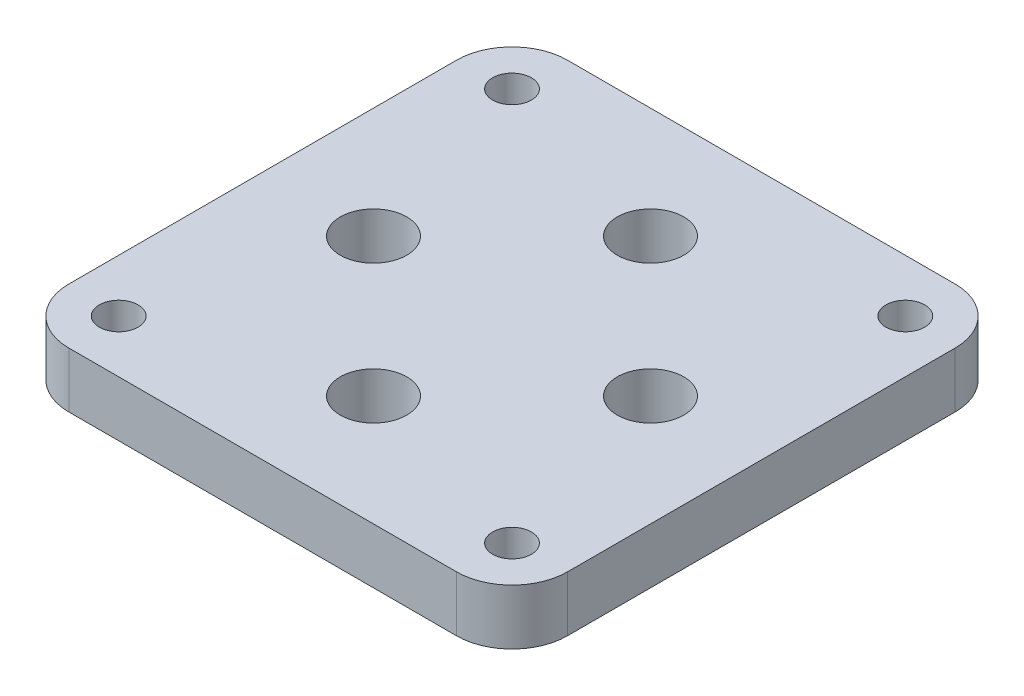
ISO-10303-21;
HEADER;
FILE_DESCRIPTION(('STEP AP214'),'2;1');
FILE_NAME('part.step','',(''),(''),'','','');
FILE_SCHEMA(('AUTOMOTIVE_DESIGN { 1 0 10303 214 1 1 1 1 }'));
ENDSEC;
DATA;
#1=APPLICATION_CONTEXT('core data for automotive mechanical design processes');
#2=APPLICATION_PROTOCOL_DEFINITION('international standard','automotive_design',2000,#1);
#3=PRODUCT_CONTEXT('',#1,'mechanical');
#4=PRODUCT('Part','Part','',(#3));
#5=PRODUCT_RELATED_PRODUCT_CATEGORY('part','',(#4));
#6=PRODUCT_DEFINITION_FORMATION('','',#4);
#7=PRODUCT_DEFINITION_CONTEXT('part definition',#1,'design');
#8=PRODUCT_DEFINITION('design','',#6,#7);
#9=PRODUCT_DEFINITION_SHAPE('','',#8);
#10=(LENGTH_UNIT() NAMED_UNIT(*) SI_UNIT(.MILLI.,.METRE.));
#11=(NAMED_UNIT(*) PLANE_ANGLE_UNIT() SI_UNIT($,.RADIAN.));
#12=(NAMED_UNIT(*) SI_UNIT($,.STERADIAN.) SOLID_ANGLE_UNIT());
#13=UNCERTAINTY_MEASURE_WITH_UNIT(LENGTH_MEASURE(1.E-05),#10,'distance_accuracy_value','');
#14=(GEOMETRIC_REPRESENTATION_CONTEXT(3) GLOBAL_UNCERTAINTY_ASSIGNED_CONTEXT((#13)) GLOBAL_UNIT_ASSIGNED_CONTEXT((#10,
#11,#12)) REPRESENTATION_CONTEXT('',''));
#15=CARTESIAN_POINT('',(0.,0.,0.));
#16=DIRECTION('',(0.,0.,1.));
#17=DIRECTION('',(1.,0.,0.));
#18=AXIS2_PLACEMENT_3D('',#15,#16,#17);
#19=CARTESIAN_POINT('',(45.,10.,-45.));
#20=DIRECTION('',(-1.,0.,0.));
#21=DIRECTION('',(0.,0.,1.));
#22=AXIS2_PLACEMENT_3D('',#19,#20,#21);
#23=PLANE('',#22);
#24=DIRECTION('',(0.,0.,-1.));
#25=VECTOR('',#24,1.);
#26=CARTESIAN_POINT('',(45.,0.,-45.));
#27=LINE('',#26,#25);
#28=CARTESIAN_POINT('',(45.,0.,35.));
#29=VERTEX_POINT('',#28);
#30=CARTESIAN_POINT('',(45.,0.,-35.));
#31=VERTEX_POINT('',#30);
#32=EDGE_CURVE('E125',#29,#31,#27,.T.);
#33=ORIENTED_EDGE('',*,*,#32,.T.);
#34=DIRECTION('',(0.,-1.,0.));
#35=VECTOR('',#34,1.);
#36=CARTESIAN_POINT('',(45.,10.,-35.));
#37=LINE('',#36,#35);
#38=CARTESIAN_POINT('',(45.,10.,-35.));
#39=VERTEX_POINT('',#38);
#40=EDGE_CURVE('E103',#31,#39,#37,.F.);
#41=ORIENTED_EDGE('',*,*,#40,.T.);
#42=DIRECTION('',(0.,0.,-1.));
#43=VECTOR('',#42,1.);
#44=CARTESIAN_POINT('',(45.,10.,-45.));
#45=LINE('',#44,#43);
#46=CARTESIAN_POINT('',(45.,10.,35.));
#47=VERTEX_POINT('',#46);
#48=EDGE_CURVE('E135',#47,#39,#45,.T.);
#49=ORIENTED_EDGE('',*,*,#48,.F.);
#50=DIRECTION('',(0.,-1.,0.));
#51=VECTOR('',#50,1.);
#52=CARTESIAN_POINT('',(45.,10.,35.));
#53=LINE('',#52,#51);
#54=EDGE_CURVE('E108',#47,#29,#53,.T.);
#55=ORIENTED_EDGE('',*,*,#54,.T.);
#56=EDGE_LOOP('',(#33,#41,#49,#55));
#57=FACE_BOUND('',#56,.T.);
#58=ADVANCED_FACE('F33',(#57),#23,.F.);
#59=CARTESIAN_POINT('',(-45.,10.,-45.));
#60=DIRECTION('',(0.,0.,1.));
#61=DIRECTION('',(1.,0.,0.));
#62=AXIS2_PLACEMENT_3D('',#59,#60,#61);
#63=PLANE('',#62);
#64=DIRECTION('',(-1.,0.,0.));
#65=VECTOR('',#64,1.);
#66=CARTESIAN_POINT('',(-45.,10.,-45.));
#67=LINE('',#66,#65);
#68=CARTESIAN_POINT('',(35.,10.,-45.));
#69=VERTEX_POINT('',#68);
#70=CARTESIAN_POINT('',(-35.,10.,-45.));
#71=VERTEX_POINT('',#70);
#72=EDGE_CURVE('E118',#69,#71,#67,.T.);
#73=ORIENTED_EDGE('',*,*,#72,.F.);
#74=DIRECTION('',(0.,-1.,0.));
#75=VECTOR('',#74,1.);
#76=CARTESIAN_POINT('',(35.,10.,-45.));
#77=LINE('',#76,#75);
#78=CARTESIAN_POINT('',(35.,0.,-45.));
#79=VERTEX_POINT('',#78);
#80=EDGE_CURVE('E102',#69,#79,#77,.T.);
#81=ORIENTED_EDGE('',*,*,#80,.T.);
#82=DIRECTION('',(-1.,0.,0.));
#83=VECTOR('',#82,1.);
#84=CARTESIAN_POINT('',(-45.,0.,-45.));
#85=LINE('',#84,#83);
#86=CARTESIAN_POINT('',(-35.,0.,-45.));
#87=VERTEX_POINT('',#86);
#88=EDGE_CURVE('E115',#79,#87,#85,.T.);
#89=ORIENTED_EDGE('',*,*,#88,.T.);
#90=DIRECTION('',(0.,-1.,0.));
#91=VECTOR('',#90,1.);
#92=CARTESIAN_POINT('',(-35.,10.,-45.));
#93=LINE('',#92,#91);
#94=EDGE_CURVE('E120',#87,#71,#93,.F.);
#95=ORIENTED_EDGE('',*,*,#94,.T.);
#96=EDGE_LOOP('',(#73,#81,#89,#95));
#97=FACE_BOUND('',#96,.T.);
#98=ADVANCED_FACE('F114',(#97),#63,.F.);
#99=CARTESIAN_POINT('',(-45.,10.,-45.));
#100=DIRECTION('',(1.,0.,0.));
#101=DIRECTION('',(0.,0.,-1.));
#102=AXIS2_PLACEMENT_3D('',#99,#100,#101);
#103=PLANE('',#102);
#104=DIRECTION('',(0.,0.,1.));
#105=VECTOR('',#104,1.);
#106=CARTESIAN_POINT('',(-45.,10.,-45.));
#107=LINE('',#106,#105);
#108=CARTESIAN_POINT('',(-45.,10.,-35.));
#109=VERTEX_POINT('',#108);
#110=CARTESIAN_POINT('',(-45.,10.,35.));
#111=VERTEX_POINT('',#110);
#112=EDGE_CURVE('E183',#109,#111,#107,.T.);
#113=ORIENTED_EDGE('',*,*,#112,.F.);
#114=DIRECTION('',(0.,-1.,0.));
#115=VECTOR('',#114,1.);
#116=CARTESIAN_POINT('',(-45.,10.,-35.));
#117=LINE('',#116,#115);
#118=CARTESIAN_POINT('',(-45.,0.,-35.));
#119=VERTEX_POINT('',#118);
#120=EDGE_CURVE('E168',#109,#119,#117,.T.);
#121=ORIENTED_EDGE('',*,*,#120,.T.);
#122=DIRECTION('',(0.,0.,1.));
#123=VECTOR('',#122,1.);
#124=CARTESIAN_POINT('',(-45.,0.,-45.));
#125=LINE('',#124,#123);
#126=CARTESIAN_POINT('',(-45.,0.,35.));
#127=VERTEX_POINT('',#126);
#128=EDGE_CURVE('E124',#119,#127,#125,.T.);
#129=ORIENTED_EDGE('',*,*,#128,.T.);
#130=DIRECTION('',(0.,-1.,0.));
#131=VECTOR('',#130,1.);
#132=CARTESIAN_POINT('',(-45.,10.,35.));
#133=LINE('',#132,#131);
#134=EDGE_CURVE('E166',#127,#111,#133,.F.);
#135=ORIENTED_EDGE('',*,*,#134,.T.);
#136=EDGE_LOOP('',(#113,#121,#129,#135));
#137=FACE_BOUND('',#136,.T.);
#138=ADVANCED_FACE('F199',(#137),#103,.F.);
#139=CARTESIAN_POINT('',(-45.,10.,45.));
#140=DIRECTION('',(0.,0.,-1.));
#141=DIRECTION('',(-1.,0.,0.));
#142=AXIS2_PLACEMENT_3D('',#139,#140,#141);
#143=PLANE('',#142);
#144=DIRECTION('',(1.,0.,0.));
#145=VECTOR('',#144,1.);
#146=CARTESIAN_POINT('',(-45.,0.,45.));
#147=LINE('',#146,#145);
#148=CARTESIAN_POINT('',(-35.,0.,45.));
#149=VERTEX_POINT('',#148);
#150=CARTESIAN_POINT('',(35.,0.,45.));
#151=VERTEX_POINT('',#150);
#152=EDGE_CURVE('E128',#149,#151,#147,.T.);
#153=ORIENTED_EDGE('',*,*,#152,.T.);
#154=DIRECTION('',(0.,-1.,0.));
#155=VECTOR('',#154,1.);
#156=CARTESIAN_POINT('',(35.,10.,45.));
#157=LINE('',#156,#155);
#158=CARTESIAN_POINT('',(35.,10.,45.));
#159=VERTEX_POINT('',#158);
#160=EDGE_CURVE('E11',#151,#159,#157,.F.);
#161=ORIENTED_EDGE('',*,*,#160,.T.);
#162=DIRECTION('',(1.,0.,0.));
#163=VECTOR('',#162,1.);
#164=CARTESIAN_POINT('',(-45.,10.,45.));
#165=LINE('',#164,#163);
#166=CARTESIAN_POINT('',(-35.,10.,45.));
#167=VERTEX_POINT('',#166);
#168=EDGE_CURVE('E150',#167,#159,#165,.T.);
#169=ORIENTED_EDGE('',*,*,#168,.F.);
#170=DIRECTION('',(0.,-1.,0.));
#171=VECTOR('',#170,1.);
#172=CARTESIAN_POINT('',(-35.,10.,45.));
#173=LINE('',#172,#171);
#174=EDGE_CURVE('E41',#167,#149,#173,.T.);
#175=ORIENTED_EDGE('',*,*,#174,.T.);
#176=EDGE_LOOP('',(#153,#161,#169,#175));
#177=FACE_BOUND('',#176,.T.);
#178=ADVANCED_FACE('F173',(#177),#143,.F.);
#179=CARTESIAN_POINT('',(0.,10.,0.));
#180=DIRECTION('',(0.,1.,0.));
#181=DIRECTION('',(0.,0.,1.));
#182=AXIS2_PLACEMENT_3D('',#179,#180,#181);
#183=PLANE('',#182);
#184=CARTESIAN_POINT('',(0.,10.,25.));
#185=DIRECTION('',(0.,1.,0.));
#186=DIRECTION('',(0.,0.,1.));
#187=AXIS2_PLACEMENT_3D('',#184,#185,#186);
#188=CIRCLE('',#187,6.);
#189=CARTESIAN_POINT('',(0.,10.,31.));
#190=VERTEX_POINT('',#189);
#191=EDGE_CURVE('E140',#190,#190,#188,.T.);
#192=ORIENTED_EDGE('',*,*,#191,.F.);
#193=EDGE_LOOP('',(#192));
#194=FACE_BOUND('',#193,.T.);
#195=CARTESIAN_POINT('',(25.,10.,0.));
#196=DIRECTION('',(0.,1.,0.));
#197=DIRECTION('',(0.,0.,1.));
#198=AXIS2_PLACEMENT_3D('',#195,#196,#197);
#199=CIRCLE('',#198,6.);
#200=CARTESIAN_POINT('',(25.,10.,6.));
#201=VERTEX_POINT('',#200);
#202=EDGE_CURVE('E380',#201,#201,#199,.T.);
#203=ORIENTED_EDGE('',*,*,#202,.F.);
#204=EDGE_LOOP('',(#203));
#205=FACE_BOUND('',#204,.T.);
#206=CARTESIAN_POINT('',(-25.,10.,0.));
#207=DIRECTION('',(0.,1.,0.));
#208=DIRECTION('',(0.,0.,1.));
#209=AXIS2_PLACEMENT_3D('',#206,#207,#208);
#210=CIRCLE('',#209,6.);
#211=CARTESIAN_POINT('',(-25.,10.,6.));
#212=VERTEX_POINT('',#211);
#213=EDGE_CURVE('E377',#212,#212,#210,.T.);
#214=ORIENTED_EDGE('',*,*,#213,.F.);
#215=EDGE_LOOP('',(#214));
#216=FACE_BOUND('',#215,.T.);
#217=CARTESIAN_POINT('',(0.,10.,-25.));
#218=DIRECTION('',(0.,1.,0.));
#219=DIRECTION('',(0.,0.,1.));
#220=AXIS2_PLACEMENT_3D('',#217,#218,#219);
#221=CIRCLE('',#220,6.);
#222=CARTESIAN_POINT('',(0.,10.,-19.));
#223=VERTEX_POINT('',#222);
#224=EDGE_CURVE('E374',#223,#223,#221,.T.);
#225=ORIENTED_EDGE('',*,*,#224,.F.);
#226=EDGE_LOOP('',(#225));
#227=FACE_BOUND('',#226,.T.);
#228=CARTESIAN_POINT('',(-35.5,10.,-35.5));
#229=DIRECTION('',(0.,1.,0.));
#230=DIRECTION('',(0.,0.,1.));
#231=AXIS2_PLACEMENT_3D('',#228,#229,#230);
#232=CIRCLE('',#231,3.49999999999999);
#233=CARTESIAN_POINT('',(-35.5,10.,-32.));
#234=VERTEX_POINT('',#233);
#235=EDGE_CURVE('E149',#234,#234,#232,.T.);
#236=ORIENTED_EDGE('',*,*,#235,.F.);
#237=EDGE_LOOP('',(#236));
#238=FACE_BOUND('',#237,.T.);
#239=CARTESIAN_POINT('',(35.5,10.,-35.5));
#240=DIRECTION('',(0.,1.,0.));
#241=DIRECTION('',(0.,0.,1.));
#242=AXIS2_PLACEMENT_3D('',#239,#240,#241);
#243=CIRCLE('',#242,3.49999999999999);
#244=CARTESIAN_POINT('',(35.5,10.,-32.));
#245=VERTEX_POINT('',#244);
#246=EDGE_CURVE('E366',#245,#245,#243,.T.);
#247=ORIENTED_EDGE('',*,*,#246,.F.);
#248=EDGE_LOOP('',(#247));
#249=FACE_BOUND('',#248,.T.);
#250=CARTESIAN_POINT('',(-35.5,10.,35.5));
#251=DIRECTION('',(0.,1.,0.));
#252=DIRECTION('',(0.,0.,1.));
#253=AXIS2_PLACEMENT_3D('',#250,#251,#252);
#254=CIRCLE('',#253,3.49999999999999);
#255=CARTESIAN_POINT('',(-35.5,10.,39.));
#256=VERTEX_POINT('',#255);
#257=EDGE_CURVE('E358',#256,#256,#254,.T.);
#258=ORIENTED_EDGE('',*,*,#257,.F.);
#259=EDGE_LOOP('',(#258));
#260=FACE_BOUND('',#259,.T.);
#261=CARTESIAN_POINT('',(35.5,10.,35.5));
#262=DIRECTION('',(0.,1.,0.));
#263=DIRECTION('',(0.,0.,1.));
#264=AXIS2_PLACEMENT_3D('',#261,#262,#263);
#265=CIRCLE('',#264,3.49999999999999);
#266=CARTESIAN_POINT('',(35.5,10.,39.));
#267=VERTEX_POINT('',#266);
#268=EDGE_CURVE('E354',#267,#267,#265,.T.);
#269=ORIENTED_EDGE('',*,*,#268,.F.);
#270=EDGE_LOOP('',(#269));
#271=FACE_BOUND('',#270,.T.);
#272=ORIENTED_EDGE('',*,*,#48,.T.);
#273=CARTESIAN_POINT('',(35.,10.,-35.));
#274=DIRECTION('',(0.,1.,0.));
#275=DIRECTION('',(0.,0.,1.));
#276=AXIS2_PLACEMENT_3D('',#273,#274,#275);
#277=CIRCLE('',#276,10.);
#278=EDGE_CURVE('E164',#39,#69,#277,.T.);
#279=ORIENTED_EDGE('',*,*,#278,.T.);
#280=ORIENTED_EDGE('',*,*,#72,.T.);
#281=CARTESIAN_POINT('',(-35.,10.,-35.));
#282=DIRECTION('',(0.,1.,0.));
#283=DIRECTION('',(0.,0.,1.));
#284=AXIS2_PLACEMENT_3D('',#281,#282,#283);
#285=CIRCLE('',#284,10.);
#286=EDGE_CURVE('E162',#71,#109,#285,.T.);
#287=ORIENTED_EDGE('',*,*,#286,.T.);
#288=ORIENTED_EDGE('',*,*,#112,.T.);
#289=CARTESIAN_POINT('',(-35.,10.,35.));
#290=DIRECTION('',(0.,1.,0.));
#291=DIRECTION('',(0.,0.,1.));
#292=AXIS2_PLACEMENT_3D('',#289,#290,#291);
#293=CIRCLE('',#292,10.);
#294=EDGE_CURVE('E53',#111,#167,#293,.T.);
#295=ORIENTED_EDGE('',*,*,#294,.T.);
#296=ORIENTED_EDGE('',*,*,#168,.T.);
#297=CARTESIAN_POINT('',(35.,10.,35.));
#298=DIRECTION('',(0.,1.,0.));
#299=DIRECTION('',(0.,0.,1.));
#300=AXIS2_PLACEMENT_3D('',#297,#298,#299);
#301=CIRCLE('',#300,10.);
#302=EDGE_CURVE('E160',#159,#47,#301,.T.);
#303=ORIENTED_EDGE('',*,*,#302,.T.);
#304=EDGE_LOOP('',(#272,#279,#280,#287,#288,#295,#296,#303));
#305=FACE_BOUND('',#304,.T.);
#306=ADVANCED_FACE('F188',(#194,#205,#216,#227,#238,#249,#260,#271,#305),#183,.T.);
#307=CARTESIAN_POINT('',(0.,0.,0.));
#308=DIRECTION('',(0.,1.,0.));
#309=DIRECTION('',(0.,0.,1.));
#310=AXIS2_PLACEMENT_3D('',#307,#308,#309);
#311=PLANE('',#310);
#312=CARTESIAN_POINT('',(0.,0.,25.));
#313=DIRECTION('',(0.,1.,0.));
#314=DIRECTION('',(0.,0.,1.));
#315=AXIS2_PLACEMENT_3D('',#312,#313,#314);
#316=CIRCLE('',#315,6.);
#317=CARTESIAN_POINT('',(0.,0.,31.));
#318=VERTEX_POINT('',#317);
#319=EDGE_CURVE('E146',#318,#318,#316,.T.);
#320=ORIENTED_EDGE('',*,*,#319,.T.);
#321=EDGE_LOOP('',(#320));
#322=FACE_BOUND('',#321,.T.);
#323=CARTESIAN_POINT('',(25.,0.,0.));
#324=DIRECTION('',(0.,1.,0.));
#325=DIRECTION('',(0.,0.,1.));
#326=AXIS2_PLACEMENT_3D('',#323,#324,#325);
#327=CIRCLE('',#326,6.);
#328=CARTESIAN_POINT('',(25.,0.,6.));
#329=VERTEX_POINT('',#328);
#330=EDGE_CURVE('E143',#329,#329,#327,.T.);
#331=ORIENTED_EDGE('',*,*,#330,.T.);
#332=EDGE_LOOP('',(#331));
#333=FACE_BOUND('',#332,.T.);
#334=CARTESIAN_POINT('',(-25.,0.,0.));
#335=DIRECTION('',(0.,1.,0.));
#336=DIRECTION('',(0.,0.,1.));
#337=AXIS2_PLACEMENT_3D('',#334,#335,#336);
#338=CIRCLE('',#337,6.);
#339=CARTESIAN_POINT('',(-25.,0.,6.));
#340=VERTEX_POINT('',#339);
#341=EDGE_CURVE('E139',#340,#340,#338,.T.);
#342=ORIENTED_EDGE('',*,*,#341,.T.);
#343=EDGE_LOOP('',(#342));
#344=FACE_BOUND('',#343,.T.);
#345=CARTESIAN_POINT('',(0.,0.,-25.));
#346=DIRECTION('',(0.,1.,0.));
#347=DIRECTION('',(0.,0.,1.));
#348=AXIS2_PLACEMENT_3D('',#345,#346,#347);
#349=CIRCLE('',#348,6.);
#350=CARTESIAN_POINT('',(0.,0.,-19.));
#351=VERTEX_POINT('',#350);
#352=EDGE_CURVE('E136',#351,#351,#349,.T.);
#353=ORIENTED_EDGE('',*,*,#352,.T.);
#354=EDGE_LOOP('',(#353));
#355=FACE_BOUND('',#354,.T.);
#356=CARTESIAN_POINT('',(-35.5,0.,-35.5));
#357=DIRECTION('',(0.,1.,0.));
#358=DIRECTION('',(0.,0.,1.));
#359=AXIS2_PLACEMENT_3D('',#356,#357,#358);
#360=CIRCLE('',#359,3.49999999999999);
#361=CARTESIAN_POINT('',(-35.5,0.,-32.));
#362=VERTEX_POINT('',#361);
#363=EDGE_CURVE('E369',#362,#362,#360,.T.);
#364=ORIENTED_EDGE('',*,*,#363,.T.);
#365=EDGE_LOOP('',(#364));
#366=FACE_BOUND('',#365,.T.);
#367=CARTESIAN_POINT('',(35.5,0.,-35.5));
#368=DIRECTION('',(0.,1.,0.));
#369=DIRECTION('',(0.,0.,1.));
#370=AXIS2_PLACEMENT_3D('',#367,#368,#369);
#371=CIRCLE('',#370,3.49999999999999);
#372=CARTESIAN_POINT('',(35.5,0.,-32.));
#373=VERTEX_POINT('',#372);
#374=EDGE_CURVE('E363',#373,#373,#371,.T.);
#375=ORIENTED_EDGE('',*,*,#374,.T.);
#376=EDGE_LOOP('',(#375));
#377=FACE_BOUND('',#376,.T.);
#378=CARTESIAN_POINT('',(-35.5,0.,35.5));
#379=DIRECTION('',(0.,1.,0.));
#380=DIRECTION('',(0.,0.,1.));
#381=AXIS2_PLACEMENT_3D('',#378,#379,#380);
#382=CIRCLE('',#381,3.49999999999999);
#383=CARTESIAN_POINT('',(-35.5,0.,39.));
#384=VERTEX_POINT('',#383);
#385=EDGE_CURVE('E356',#384,#384,#382,.T.);
#386=ORIENTED_EDGE('',*,*,#385,.T.);
#387=EDGE_LOOP('',(#386));
#388=FACE_BOUND('',#387,.T.);
#389=CARTESIAN_POINT('',(35.5,0.,35.5));
#390=DIRECTION('',(0.,1.,0.));
#391=DIRECTION('',(0.,0.,1.));
#392=AXIS2_PLACEMENT_3D('',#389,#390,#391);
#393=CIRCLE('',#392,3.49999999999999);
#394=CARTESIAN_POINT('',(35.5,0.,39.));
#395=VERTEX_POINT('',#394);
#396=EDGE_CURVE('E130',#395,#395,#393,.T.);
#397=ORIENTED_EDGE('',*,*,#396,.T.);
#398=EDGE_LOOP('',(#397));
#399=FACE_BOUND('',#398,.T.);
#400=ORIENTED_EDGE('',*,*,#88,.F.);
#401=CARTESIAN_POINT('',(35.,0.,-35.));
#402=DIRECTION('',(0.,1.,0.));
#403=DIRECTION('',(0.,0.,1.));
#404=AXIS2_PLACEMENT_3D('',#401,#402,#403);
#405=CIRCLE('',#404,10.);
#406=EDGE_CURVE('E98',#79,#31,#405,.F.);
#407=ORIENTED_EDGE('',*,*,#406,.T.);
#408=ORIENTED_EDGE('',*,*,#32,.F.);
#409=CARTESIAN_POINT('',(35.,0.,35.));
#410=DIRECTION('',(0.,1.,0.));
#411=DIRECTION('',(0.,0.,1.));
#412=AXIS2_PLACEMENT_3D('',#409,#410,#411);
#413=CIRCLE('',#412,10.);
#414=EDGE_CURVE('E153',#29,#151,#413,.F.);
#415=ORIENTED_EDGE('',*,*,#414,.T.);
#416=ORIENTED_EDGE('',*,*,#152,.F.);
#417=CARTESIAN_POINT('',(-35.,0.,35.));
#418=DIRECTION('',(0.,1.,0.));
#419=DIRECTION('',(0.,0.,1.));
#420=AXIS2_PLACEMENT_3D('',#417,#418,#419);
#421=CIRCLE('',#420,10.);
#422=EDGE_CURVE('E119',#149,#127,#421,.F.);
#423=ORIENTED_EDGE('',*,*,#422,.T.);
#424=ORIENTED_EDGE('',*,*,#128,.F.);
#425=CARTESIAN_POINT('',(-35.,0.,-35.));
#426=DIRECTION('',(0.,1.,0.));
#427=DIRECTION('',(0.,0.,1.));
#428=AXIS2_PLACEMENT_3D('',#425,#426,#427);
#429=CIRCLE('',#428,10.);
#430=EDGE_CURVE('E109',#119,#87,#429,.F.);
#431=ORIENTED_EDGE('',*,*,#430,.T.);
#432=EDGE_LOOP('',(#400,#407,#408,#415,#416,#423,#424,#431));
#433=FACE_BOUND('',#432,.T.);
#434=ADVANCED_FACE('F122',(#322,#333,#344,#355,#366,#377,#388,#399,#433),#311,.F.);
#435=CARTESIAN_POINT('',(35.5,10.,35.5));
#436=DIRECTION('',(0.,1.,0.));
#437=DIRECTION('',(0.,0.,1.));
#438=AXIS2_PLACEMENT_3D('',#435,#436,#437);
#439=CYLINDRICAL_SURFACE('',#438,3.49999999999999);
#440=ORIENTED_EDGE('',*,*,#396,.F.);
#441=EDGE_LOOP('',(#440));
#442=FACE_BOUND('',#441,.T.);
#443=ORIENTED_EDGE('',*,*,#268,.T.);
#444=EDGE_LOOP('',(#443));
#445=FACE_BOUND('',#444,.T.);
#446=ADVANCED_FACE('F196',(#442,#445),#439,.F.);
#447=CARTESIAN_POINT('',(-35.5,10.,35.5));
#448=DIRECTION('',(0.,1.,0.));
#449=DIRECTION('',(0.,0.,1.));
#450=AXIS2_PLACEMENT_3D('',#447,#448,#449);
#451=CYLINDRICAL_SURFACE('',#450,3.49999999999999);
#452=ORIENTED_EDGE('',*,*,#385,.F.);
#453=EDGE_LOOP('',(#452));
#454=FACE_BOUND('',#453,.T.);
#455=ORIENTED_EDGE('',*,*,#257,.T.);
#456=EDGE_LOOP('',(#455));
#457=FACE_BOUND('',#456,.T.);
#458=ADVANCED_FACE('F318',(#454,#457),#451,.F.);
#459=CARTESIAN_POINT('',(35.5,10.,-35.5));
#460=DIRECTION('',(0.,1.,0.));
#461=DIRECTION('',(0.,0.,1.));
#462=AXIS2_PLACEMENT_3D('',#459,#460,#461);
#463=CYLINDRICAL_SURFACE('',#462,3.49999999999999);
#464=ORIENTED_EDGE('',*,*,#374,.F.);
#465=EDGE_LOOP('',(#464));
#466=FACE_BOUND('',#465,.T.);
#467=ORIENTED_EDGE('',*,*,#246,.T.);
#468=EDGE_LOOP('',(#467));
#469=FACE_BOUND('',#468,.T.);
#470=ADVANCED_FACE('F310',(#466,#469),#463,.F.);
#471=CARTESIAN_POINT('',(-35.5,10.,-35.5));
#472=DIRECTION('',(0.,1.,0.));
#473=DIRECTION('',(0.,0.,1.));
#474=AXIS2_PLACEMENT_3D('',#471,#472,#473);
#475=CYLINDRICAL_SURFACE('',#474,3.49999999999999);
#476=ORIENTED_EDGE('',*,*,#363,.F.);
#477=EDGE_LOOP('',(#476));
#478=FACE_BOUND('',#477,.T.);
#479=ORIENTED_EDGE('',*,*,#235,.T.);
#480=EDGE_LOOP('',(#479));
#481=FACE_BOUND('',#480,.T.);
#482=ADVANCED_FACE('F302',(#478,#481),#475,.F.);
#483=CARTESIAN_POINT('',(0.,-16.,-25.));
#484=DIRECTION('',(0.,1.,0.));
#485=DIRECTION('',(0.,0.,1.));
#486=AXIS2_PLACEMENT_3D('',#483,#484,#485);
#487=CYLINDRICAL_SURFACE('',#486,6.);
#488=CARTESIAN_POINT('',(0.,10.,-19.));
#489=CARTESIAN_POINT('',(0.,9.89583333333333,-19.));
#490=CARTESIAN_POINT('',(0.,9.79166666666667,-19.));
#491=CARTESIAN_POINT('',(0.,9.58333333333333,-19.));
#492=CARTESIAN_POINT('',(0.,9.47916666666667,-19.));
#493=CARTESIAN_POINT('',(0.,9.27083333333333,-19.));
#494=CARTESIAN_POINT('',(0.,9.16666666666666,-19.));
#495=CARTESIAN_POINT('',(0.,8.95833333333333,-19.));
#496=CARTESIAN_POINT('',(0.,8.85416666666666,-19.));
#497=CARTESIAN_POINT('',(0.,8.64583333333333,-19.));
#498=CARTESIAN_POINT('',(0.,8.54166666666666,-19.));
#499=CARTESIAN_POINT('',(0.,8.33333333333333,-19.));
#500=CARTESIAN_POINT('',(0.,8.22916666666666,-19.));
#501=CARTESIAN_POINT('',(0.,8.02083333333333,-19.));
#502=CARTESIAN_POINT('',(0.,7.91666666666666,-19.));
#503=CARTESIAN_POINT('',(0.,7.70833333333333,-19.));
#504=CARTESIAN_POINT('',(0.,7.60416666666666,-19.));
#505=CARTESIAN_POINT('',(0.,7.39583333333333,-19.));
#506=CARTESIAN_POINT('',(0.,7.29166666666666,-19.));
#507=CARTESIAN_POINT('',(0.,7.08333333333333,-19.));
#508=CARTESIAN_POINT('',(0.,6.97916666666667,-19.));
#509=CARTESIAN_POINT('',(0.,6.77083333333333,-19.));
#510=CARTESIAN_POINT('',(0.,6.66666666666667,-19.));
#511=CARTESIAN_POINT('',(0.,6.45833333333333,-19.));
#512=CARTESIAN_POINT('',(0.,6.35416666666667,-19.));
#513=CARTESIAN_POINT('',(0.,6.14583333333333,-19.));
#514=CARTESIAN_POINT('',(0.,6.04166666666667,-19.));
#515=CARTESIAN_POINT('',(0.,5.83333333333333,-19.));
#516=CARTESIAN_POINT('',(0.,5.72916666666666,-19.));
#517=CARTESIAN_POINT('',(0.,5.52083333333333,-19.));
#518=CARTESIAN_POINT('',(0.,5.41666666666666,-19.));
#519=CARTESIAN_POINT('',(0.,5.20833333333333,-19.));
#520=CARTESIAN_POINT('',(0.,5.10416666666666,-19.));
#521=CARTESIAN_POINT('',(0.,4.89583333333333,-19.));
#522=CARTESIAN_POINT('',(0.,4.79166666666666,-19.));
#523=CARTESIAN_POINT('',(0.,4.58333333333333,-19.));
#524=CARTESIAN_POINT('',(0.,4.47916666666666,-19.));
#525=CARTESIAN_POINT('',(0.,4.27083333333333,-19.));
#526=CARTESIAN_POINT('',(0.,4.16666666666666,-19.));
#527=CARTESIAN_POINT('',(0.,3.95833333333333,-19.));
#528=CARTESIAN_POINT('',(0.,3.85416666666666,-19.));
#529=CARTESIAN_POINT('',(0.,3.64583333333333,-19.));
#530=CARTESIAN_POINT('',(0.,3.54166666666666,-19.));
#531=CARTESIAN_POINT('',(0.,3.33333333333333,-19.));
#532=CARTESIAN_POINT('',(0.,3.22916666666666,-19.));
#533=CARTESIAN_POINT('',(0.,3.02083333333333,-19.));
#534=CARTESIAN_POINT('',(0.,2.91666666666667,-19.));
#535=CARTESIAN_POINT('',(0.,2.70833333333333,-19.));
#536=CARTESIAN_POINT('',(0.,2.60416666666667,-19.));
#537=CARTESIAN_POINT('',(0.,2.39583333333333,-19.));
#538=CARTESIAN_POINT('',(0.,2.29166666666667,-19.));
#539=CARTESIAN_POINT('',(0.,2.08333333333333,-19.));
#540=CARTESIAN_POINT('',(0.,1.97916666666667,-19.));
#541=CARTESIAN_POINT('',(0.,1.77083333333333,-19.));
#542=CARTESIAN_POINT('',(0.,1.66666666666666,-19.));
#543=CARTESIAN_POINT('',(0.,1.45833333333333,-19.));
#544=CARTESIAN_POINT('',(0.,1.35416666666666,-19.));
#545=CARTESIAN_POINT('',(0.,1.14583333333333,-19.));
#546=CARTESIAN_POINT('',(0.,1.04166666666666,-19.));
#547=CARTESIAN_POINT('',(0.,0.833333333333331,-19.));
#548=CARTESIAN_POINT('',(0.,0.729166666666664,-19.));
#549=CARTESIAN_POINT('',(0.,0.52083333333333,-19.));
#550=CARTESIAN_POINT('',(0.,0.416666666666664,-19.));
#551=CARTESIAN_POINT('',(0.,0.20833333333333,-19.));
#552=CARTESIAN_POINT('',(0.,0.104166666666663,-19.));
#553=CARTESIAN_POINT('',(0.,0.,-19.));
#554=B_SPLINE_CURVE_WITH_KNOTS('',3,(#488,#489,#490,#491,#492,#493,#494,#495,#496,#497,#498,
#499,#500,#501,#502,#503,#504,#505,#506,#507,#508,#509,#510,#511,#512,#513,#514,#515,#516,#517,
#518,#519,#520,#521,#522,#523,#524,#525,#526,#527,#528,#529,#530,#531,#532,#533,#534,#535,#536,
#537,#538,#539,#540,#541,#542,#543,#544,#545,#546,#547,#548,#549,#550,#551,#552,#553),
.UNSPECIFIED.,.F.,.F.,(4,2,2,2,2,2,2,2,2,2,2,2,2,2,2,2,2,2,2,2,2,2,2,2,2,2,2,2,2,2,2,2,4),(0.,
0.3125,0.625000000000001,0.937500000000001,1.25,1.5625,1.875,2.1875,2.5,2.8125,3.125,3.4375,
3.75,4.0625,4.375,4.6875,5.,5.3125,5.625,5.9375,6.25,6.5625,6.875,7.1875,7.5,7.8125,8.125,
8.4375,8.75,9.0625,9.375,9.6875,10.),.UNSPECIFIED.);
#555=EDGE_CURVE('BSEAM294',#223,#351,#554,.T.);
#556=ORIENTED_EDGE('',*,*,#224,.T.);
#557=ORIENTED_EDGE('',*,*,#352,.F.);
#558=ORIENTED_EDGE('',*,*,#555,.T.);
#559=ORIENTED_EDGE('',*,*,#555,.F.);
#560=EDGE_LOOP('',(#556,#558,#557,#559));
#561=FACE_BOUND('',#560,.T.);
#562=ADVANCED_FACE('F294',(#561),#487,.F.);
#563=CARTESIAN_POINT('',(-25.,-16.,0.));
#564=DIRECTION('',(0.,1.,0.));
#565=DIRECTION('',(0.,0.,1.));
#566=AXIS2_PLACEMENT_3D('',#563,#564,#565);
#567=CYLINDRICAL_SURFACE('',#566,6.);
#568=CARTESIAN_POINT('',(-25.,10.,6.));
#569=CARTESIAN_POINT('',(-25.,9.89583333333333,6.));
#570=CARTESIAN_POINT('',(-25.,9.79166666666667,6.));
#571=CARTESIAN_POINT('',(-25.,9.58333333333333,6.));
#572=CARTESIAN_POINT('',(-25.,9.47916666666667,6.));
#573=CARTESIAN_POINT('',(-25.,9.27083333333333,6.));
#574=CARTESIAN_POINT('',(-25.,9.16666666666666,6.));
#575=CARTESIAN_POINT('',(-25.,8.95833333333333,6.));
#576=CARTESIAN_POINT('',(-25.,8.85416666666666,6.));
#577=CARTESIAN_POINT('',(-25.,8.64583333333333,6.));
#578=CARTESIAN_POINT('',(-25.,8.54166666666666,6.));
#579=CARTESIAN_POINT('',(-25.,8.33333333333333,6.));
#580=CARTESIAN_POINT('',(-25.,8.22916666666666,6.));
#581=CARTESIAN_POINT('',(-25.,8.02083333333333,6.));
#582=CARTESIAN_POINT('',(-25.,7.91666666666666,6.));
#583=CARTESIAN_POINT('',(-25.,7.70833333333333,6.));
#584=CARTESIAN_POINT('',(-25.,7.60416666666666,6.));
#585=CARTESIAN_POINT('',(-25.,7.39583333333333,6.));
#586=CARTESIAN_POINT('',(-25.,7.29166666666666,6.));
#587=CARTESIAN_POINT('',(-25.,7.08333333333333,6.));
#588=CARTESIAN_POINT('',(-25.,6.97916666666667,6.));
#589=CARTESIAN_POINT('',(-25.,6.77083333333333,6.));
#590=CARTESIAN_POINT('',(-25.,6.66666666666667,6.));
#591=CARTESIAN_POINT('',(-25.,6.45833333333333,6.));
#592=CARTESIAN_POINT('',(-25.,6.35416666666667,6.));
#593=CARTESIAN_POINT('',(-25.,6.14583333333333,6.));
#594=CARTESIAN_POINT('',(-25.,6.04166666666667,6.));
#595=CARTESIAN_POINT('',(-25.,5.83333333333333,6.));
#596=CARTESIAN_POINT('',(-25.,5.72916666666666,6.));
#597=CARTESIAN_POINT('',(-25.,5.52083333333333,6.));
#598=CARTESIAN_POINT('',(-25.,5.41666666666666,6.));
#599=CARTESIAN_POINT('',(-25.,5.20833333333333,6.));
#600=CARTESIAN_POINT('',(-25.,5.10416666666666,6.));
#601=CARTESIAN_POINT('',(-25.,4.89583333333333,6.));
#602=CARTESIAN_POINT('',(-25.,4.79166666666666,6.));
#603=CARTESIAN_POINT('',(-25.,4.58333333333333,6.));
#604=CARTESIAN_POINT('',(-25.,4.47916666666666,6.));
#605=CARTESIAN_POINT('',(-25.,4.27083333333333,6.));
#606=CARTESIAN_POINT('',(-25.,4.16666666666666,6.));
#607=CARTESIAN_POINT('',(-25.,3.95833333333333,6.));
#608=CARTESIAN_POINT('',(-25.,3.85416666666666,6.));
#609=CARTESIAN_POINT('',(-25.,3.64583333333333,6.));
#610=CARTESIAN_POINT('',(-25.,3.54166666666666,6.));
#611=CARTESIAN_POINT('',(-25.,3.33333333333333,6.));
#612=CARTESIAN_POINT('',(-25.,3.22916666666666,6.));
#613=CARTESIAN_POINT('',(-25.,3.02083333333333,6.));
#614=CARTESIAN_POINT('',(-25.,2.91666666666667,6.));
#615=CARTESIAN_POINT('',(-25.,2.70833333333333,6.));
#616=CARTESIAN_POINT('',(-25.,2.60416666666667,6.));
#617=CARTESIAN_POINT('',(-25.,2.39583333333333,6.));
#618=CARTESIAN_POINT('',(-25.,2.29166666666667,6.));
#619=CARTESIAN_POINT('',(-25.,2.08333333333333,6.));
#620=CARTESIAN_POINT('',(-25.,1.97916666666667,6.));
#621=CARTESIAN_POINT('',(-25.,1.77083333333333,6.));
#622=CARTESIAN_POINT('',(-25.,1.66666666666666,6.));
#623=CARTESIAN_POINT('',(-25.,1.45833333333333,6.));
#624=CARTESIAN_POINT('',(-25.,1.35416666666666,6.));
#625=CARTESIAN_POINT('',(-25.,1.14583333333333,6.));
#626=CARTESIAN_POINT('',(-25.,1.04166666666666,6.));
#627=CARTESIAN_POINT('',(-25.,0.833333333333331,6.));
#628=CARTESIAN_POINT('',(-25.,0.729166666666664,6.));
#629=CARTESIAN_POINT('',(-25.,0.52083333333333,6.));
#630=CARTESIAN_POINT('',(-25.,0.416666666666664,6.));
#631=CARTESIAN_POINT('',(-25.,0.20833333333333,6.));
#632=CARTESIAN_POINT('',(-25.,0.104166666666663,6.));
#633=CARTESIAN_POINT('',(-25.,0.,6.));
#634=B_SPLINE_CURVE_WITH_KNOTS('',3,(#568,#569,#570,#571,#572,#573,#574,#575,#576,#577,#578,
#579,#580,#581,#582,#583,#584,#585,#586,#587,#588,#589,#590,#591,#592,#593,#594,#595,#596,#597,
#598,#599,#600,#601,#602,#603,#604,#605,#606,#607,#608,#609,#610,#611,#612,#613,#614,#615,#616,
#617,#618,#619,#620,#621,#622,#623,#624,#625,#626,#627,#628,#629,#630,#631,#632,#633),
.UNSPECIFIED.,.F.,.F.,(4,2,2,2,2,2,2,2,2,2,2,2,2,2,2,2,2,2,2,2,2,2,2,2,2,2,2,2,2,2,2,2,4),(0.,
0.3125,0.625000000000001,0.937500000000001,1.25,1.5625,1.875,2.1875,2.5,2.8125,3.125,3.4375,
3.75,4.0625,4.375,4.6875,5.,5.3125,5.625,5.9375,6.25,6.5625,6.875,7.1875,7.5,7.8125,8.125,
8.4375,8.75,9.0625,9.375,9.6875,10.),.UNSPECIFIED.);
#635=EDGE_CURVE('BSEAM286',#212,#340,#634,.T.);
#636=ORIENTED_EDGE('',*,*,#213,.T.);
#637=ORIENTED_EDGE('',*,*,#341,.F.);
#638=ORIENTED_EDGE('',*,*,#635,.T.);
#639=ORIENTED_EDGE('',*,*,#635,.F.);
#640=EDGE_LOOP('',(#636,#638,#637,#639));
#641=FACE_BOUND('',#640,.T.);
#642=ADVANCED_FACE('F286',(#641),#567,.F.);
#643=CARTESIAN_POINT('',(25.,-16.,0.));
#644=DIRECTION('',(0.,1.,0.));
#645=DIRECTION('',(0.,0.,1.));
#646=AXIS2_PLACEMENT_3D('',#643,#644,#645);
#647=CYLINDRICAL_SURFACE('',#646,6.);
#648=CARTESIAN_POINT('',(25.,10.,6.));
#649=CARTESIAN_POINT('',(25.,9.89583333333333,6.));
#650=CARTESIAN_POINT('',(25.,9.79166666666667,6.));
#651=CARTESIAN_POINT('',(25.,9.58333333333333,6.));
#652=CARTESIAN_POINT('',(25.,9.47916666666667,6.));
#653=CARTESIAN_POINT('',(25.,9.27083333333333,6.));
#654=CARTESIAN_POINT('',(25.,9.16666666666666,6.));
#655=CARTESIAN_POINT('',(25.,8.95833333333333,6.));
#656=CARTESIAN_POINT('',(25.,8.85416666666666,6.));
#657=CARTESIAN_POINT('',(25.,8.64583333333333,6.));
#658=CARTESIAN_POINT('',(25.,8.54166666666666,6.));
#659=CARTESIAN_POINT('',(25.,8.33333333333333,6.));
#660=CARTESIAN_POINT('',(25.,8.22916666666666,6.));
#661=CARTESIAN_POINT('',(25.,8.02083333333333,6.));
#662=CARTESIAN_POINT('',(25.,7.91666666666666,6.));
#663=CARTESIAN_POINT('',(25.,7.70833333333333,6.));
#664=CARTESIAN_POINT('',(25.,7.60416666666666,6.));
#665=CARTESIAN_POINT('',(25.,7.39583333333333,6.));
#666=CARTESIAN_POINT('',(25.,7.29166666666666,6.));
#667=CARTESIAN_POINT('',(25.,7.08333333333333,6.));
#668=CARTESIAN_POINT('',(25.,6.97916666666667,6.));
#669=CARTESIAN_POINT('',(25.,6.77083333333333,6.));
#670=CARTESIAN_POINT('',(25.,6.66666666666667,6.));
#671=CARTESIAN_POINT('',(25.,6.45833333333333,6.));
#672=CARTESIAN_POINT('',(25.,6.35416666666667,6.));
#673=CARTESIAN_POINT('',(25.,6.14583333333333,6.));
#674=CARTESIAN_POINT('',(25.,6.04166666666667,6.));
#675=CARTESIAN_POINT('',(25.,5.83333333333333,6.));
#676=CARTESIAN_POINT('',(25.,5.72916666666666,6.));
#677=CARTESIAN_POINT('',(25.,5.52083333333333,6.));
#678=CARTESIAN_POINT('',(25.,5.41666666666666,6.));
#679=CARTESIAN_POINT('',(25.,5.20833333333333,6.));
#680=CARTESIAN_POINT('',(25.,5.10416666666666,6.));
#681=CARTESIAN_POINT('',(25.,4.89583333333333,6.));
#682=CARTESIAN_POINT('',(25.,4.79166666666666,6.));
#683=CARTESIAN_POINT('',(25.,4.58333333333333,6.));
#684=CARTESIAN_POINT('',(25.,4.47916666666666,6.));
#685=CARTESIAN_POINT('',(25.,4.27083333333333,6.));
#686=CARTESIAN_POINT('',(25.,4.16666666666666,6.));
#687=CARTESIAN_POINT('',(25.,3.95833333333333,6.));
#688=CARTESIAN_POINT('',(25.,3.85416666666666,6.));
#689=CARTESIAN_POINT('',(25.,3.64583333333333,6.));
#690=CARTESIAN_POINT('',(25.,3.54166666666666,6.));
#691=CARTESIAN_POINT('',(25.,3.33333333333333,6.));
#692=CARTESIAN_POINT('',(25.,3.22916666666666,6.));
#693=CARTESIAN_POINT('',(25.,3.02083333333333,6.));
#694=CARTESIAN_POINT('',(25.,2.91666666666667,6.));
#695=CARTESIAN_POINT('',(25.,2.70833333333333,6.));
#696=CARTESIAN_POINT('',(25.,2.60416666666667,6.));
#697=CARTESIAN_POINT('',(25.,2.39583333333333,6.));
#698=CARTESIAN_POINT('',(25.,2.29166666666667,6.));
#699=CARTESIAN_POINT('',(25.,2.08333333333333,6.));
#700=CARTESIAN_POINT('',(25.,1.97916666666667,6.));
#701=CARTESIAN_POINT('',(25.,1.77083333333333,6.));
#702=CARTESIAN_POINT('',(25.,1.66666666666666,6.));
#703=CARTESIAN_POINT('',(25.,1.45833333333333,6.));
#704=CARTESIAN_POINT('',(25.,1.35416666666666,6.));
#705=CARTESIAN_POINT('',(25.,1.14583333333333,6.));
#706=CARTESIAN_POINT('',(25.,1.04166666666666,6.));
#707=CARTESIAN_POINT('',(25.,0.833333333333331,6.));
#708=CARTESIAN_POINT('',(25.,0.729166666666664,6.));
#709=CARTESIAN_POINT('',(25.,0.52083333333333,6.));
#710=CARTESIAN_POINT('',(25.,0.416666666666664,6.));
#711=CARTESIAN_POINT('',(25.,0.20833333333333,6.));
#712=CARTESIAN_POINT('',(25.,0.104166666666663,6.));
#713=CARTESIAN_POINT('',(25.,0.,6.));
#714=B_SPLINE_CURVE_WITH_KNOTS('',3,(#648,#649,#650,#651,#652,#653,#654,#655,#656,#657,#658,
#659,#660,#661,#662,#663,#664,#665,#666,#667,#668,#669,#670,#671,#672,#673,#674,#675,#676,#677,
#678,#679,#680,#681,#682,#683,#684,#685,#686,#687,#688,#689,#690,#691,#692,#693,#694,#695,#696,
#697,#698,#699,#700,#701,#702,#703,#704,#705,#706,#707,#708,#709,#710,#711,#712,#713),
.UNSPECIFIED.,.F.,.F.,(4,2,2,2,2,2,2,2,2,2,2,2,2,2,2,2,2,2,2,2,2,2,2,2,2,2,2,2,2,2,2,2,4),(0.,
0.3125,0.625000000000001,0.937500000000001,1.25,1.5625,1.875,2.1875,2.5,2.8125,3.125,3.4375,
3.75,4.0625,4.375,4.6875,5.,5.3125,5.625,5.9375,6.25,6.5625,6.875,7.1875,7.5,7.8125,8.125,
8.4375,8.75,9.0625,9.375,9.6875,10.),.UNSPECIFIED.);
#715=EDGE_CURVE('BSEAM279',#201,#329,#714,.T.);
#716=ORIENTED_EDGE('',*,*,#202,.T.);
#717=ORIENTED_EDGE('',*,*,#330,.F.);
#718=ORIENTED_EDGE('',*,*,#715,.T.);
#719=ORIENTED_EDGE('',*,*,#715,.F.);
#720=EDGE_LOOP('',(#716,#718,#717,#719));
#721=FACE_BOUND('',#720,.T.);
#722=ADVANCED_FACE('F279',(#721),#647,.F.);
#723=CARTESIAN_POINT('',(0.,-16.,25.));
#724=DIRECTION('',(0.,1.,0.));
#725=DIRECTION('',(0.,0.,1.));
#726=AXIS2_PLACEMENT_3D('',#723,#724,#725);
#727=CYLINDRICAL_SURFACE('',#726,6.);
#728=CARTESIAN_POINT('',(0.,10.,31.));
#729=CARTESIAN_POINT('',(0.,9.89583333333333,31.));
#730=CARTESIAN_POINT('',(0.,9.79166666666667,31.));
#731=CARTESIAN_POINT('',(0.,9.58333333333333,31.));
#732=CARTESIAN_POINT('',(0.,9.47916666666667,31.));
#733=CARTESIAN_POINT('',(0.,9.27083333333333,31.));
#734=CARTESIAN_POINT('',(0.,9.16666666666666,31.));
#735=CARTESIAN_POINT('',(0.,8.95833333333333,31.));
#736=CARTESIAN_POINT('',(0.,8.85416666666666,31.));
#737=CARTESIAN_POINT('',(0.,8.64583333333333,31.));
#738=CARTESIAN_POINT('',(0.,8.54166666666666,31.));
#739=CARTESIAN_POINT('',(0.,8.33333333333333,31.));
#740=CARTESIAN_POINT('',(0.,8.22916666666666,31.));
#741=CARTESIAN_POINT('',(0.,8.02083333333333,31.));
#742=CARTESIAN_POINT('',(0.,7.91666666666666,31.));
#743=CARTESIAN_POINT('',(0.,7.70833333333333,31.));
#744=CARTESIAN_POINT('',(0.,7.60416666666666,31.));
#745=CARTESIAN_POINT('',(0.,7.39583333333333,31.));
#746=CARTESIAN_POINT('',(0.,7.29166666666666,31.));
#747=CARTESIAN_POINT('',(0.,7.08333333333333,31.));
#748=CARTESIAN_POINT('',(0.,6.97916666666667,31.));
#749=CARTESIAN_POINT('',(0.,6.77083333333333,31.));
#750=CARTESIAN_POINT('',(0.,6.66666666666667,31.));
#751=CARTESIAN_POINT('',(0.,6.45833333333333,31.));
#752=CARTESIAN_POINT('',(0.,6.35416666666667,31.));
#753=CARTESIAN_POINT('',(0.,6.14583333333333,31.));
#754=CARTESIAN_POINT('',(0.,6.04166666666667,31.));
#755=CARTESIAN_POINT('',(0.,5.83333333333333,31.));
#756=CARTESIAN_POINT('',(0.,5.72916666666666,31.));
#757=CARTESIAN_POINT('',(0.,5.52083333333333,31.));
#758=CARTESIAN_POINT('',(0.,5.41666666666666,31.));
#759=CARTESIAN_POINT('',(0.,5.20833333333333,31.));
#760=CARTESIAN_POINT('',(0.,5.10416666666666,31.));
#761=CARTESIAN_POINT('',(0.,4.89583333333333,31.));
#762=CARTESIAN_POINT('',(0.,4.79166666666666,31.));
#763=CARTESIAN_POINT('',(0.,4.58333333333333,31.));
#764=CARTESIAN_POINT('',(0.,4.47916666666666,31.));
#765=CARTESIAN_POINT('',(0.,4.27083333333333,31.));
#766=CARTESIAN_POINT('',(0.,4.16666666666666,31.));
#767=CARTESIAN_POINT('',(0.,3.95833333333333,31.));
#768=CARTESIAN_POINT('',(0.,3.85416666666666,31.));
#769=CARTESIAN_POINT('',(0.,3.64583333333333,31.));
#770=CARTESIAN_POINT('',(0.,3.54166666666666,31.));
#771=CARTESIAN_POINT('',(0.,3.33333333333333,31.));
#772=CARTESIAN_POINT('',(0.,3.22916666666666,31.));
#773=CARTESIAN_POINT('',(0.,3.02083333333333,31.));
#774=CARTESIAN_POINT('',(0.,2.91666666666667,31.));
#775=CARTESIAN_POINT('',(0.,2.70833333333333,31.));
#776=CARTESIAN_POINT('',(0.,2.60416666666667,31.));
#777=CARTESIAN_POINT('',(0.,2.39583333333333,31.));
#778=CARTESIAN_POINT('',(0.,2.29166666666667,31.));
#779=CARTESIAN_POINT('',(0.,2.08333333333333,31.));
#780=CARTESIAN_POINT('',(0.,1.97916666666667,31.));
#781=CARTESIAN_POINT('',(0.,1.77083333333333,31.));
#782=CARTESIAN_POINT('',(0.,1.66666666666666,31.));
#783=CARTESIAN_POINT('',(0.,1.45833333333333,31.));
#784=CARTESIAN_POINT('',(0.,1.35416666666666,31.));
#785=CARTESIAN_POINT('',(0.,1.14583333333333,31.));
#786=CARTESIAN_POINT('',(0.,1.04166666666666,31.));
#787=CARTESIAN_POINT('',(0.,0.833333333333331,31.));
#788=CARTESIAN_POINT('',(0.,0.729166666666664,31.));
#789=CARTESIAN_POINT('',(0.,0.52083333333333,31.));
#790=CARTESIAN_POINT('',(0.,0.416666666666664,31.));
#791=CARTESIAN_POINT('',(0.,0.20833333333333,31.));
#792=CARTESIAN_POINT('',(0.,0.104166666666663,31.));
#793=CARTESIAN_POINT('',(0.,0.,31.));
#794=B_SPLINE_CURVE_WITH_KNOTS('',3,(#728,#729,#730,#731,#732,#733,#734,#735,#736,#737,#738,
#739,#740,#741,#742,#743,#744,#745,#746,#747,#748,#749,#750,#751,#752,#753,#754,#755,#756,#757,
#758,#759,#760,#761,#762,#763,#764,#765,#766,#767,#768,#769,#770,#771,#772,#773,#774,#775,#776,
#777,#778,#779,#780,#781,#782,#783,#784,#785,#786,#787,#788,#789,#790,#791,#792,#793),
.UNSPECIFIED.,.F.,.F.,(4,2,2,2,2,2,2,2,2,2,2,2,2,2,2,2,2,2,2,2,2,2,2,2,2,2,2,2,2,2,2,2,4),(0.,
0.3125,0.625000000000001,0.937500000000001,1.25,1.5625,1.875,2.1875,2.5,2.8125,3.125,3.4375,
3.75,4.0625,4.375,4.6875,5.,5.3125,5.625,5.9375,6.25,6.5625,6.875,7.1875,7.5,7.8125,8.125,
8.4375,8.75,9.0625,9.375,9.6875,10.),.UNSPECIFIED.);
#795=EDGE_CURVE('BSEAM215',#190,#318,#794,.T.);
#796=ORIENTED_EDGE('',*,*,#191,.T.);
#797=ORIENTED_EDGE('',*,*,#319,.F.);
#798=ORIENTED_EDGE('',*,*,#795,.T.);
#799=ORIENTED_EDGE('',*,*,#795,.F.);
#800=EDGE_LOOP('',(#796,#798,#797,#799));
#801=FACE_BOUND('',#800,.T.);
#802=ADVANCED_FACE('F215',(#801),#727,.F.);
#803=CARTESIAN_POINT('',(35.,10.,-35.));
#804=DIRECTION('',(0.,-1.,0.));
#805=DIRECTION('',(0.,0.,-1.));
#806=AXIS2_PLACEMENT_3D('',#803,#804,#805);
#807=CYLINDRICAL_SURFACE('',#806,10.);
#808=ORIENTED_EDGE('',*,*,#278,.F.);
#809=ORIENTED_EDGE('',*,*,#40,.F.);
#810=ORIENTED_EDGE('',*,*,#406,.F.);
#811=ORIENTED_EDGE('',*,*,#80,.F.);
#812=EDGE_LOOP('',(#808,#809,#810,#811));
#813=FACE_BOUND('',#812,.T.);
#814=ADVANCED_FACE('F101',(#813),#807,.T.);
#815=CARTESIAN_POINT('',(-35.,10.,-35.));
#816=DIRECTION('',(0.,-1.,0.));
#817=DIRECTION('',(0.,0.,-1.));
#818=AXIS2_PLACEMENT_3D('',#815,#816,#817);
#819=CYLINDRICAL_SURFACE('',#818,10.);
#820=ORIENTED_EDGE('',*,*,#286,.F.);
#821=ORIENTED_EDGE('',*,*,#94,.F.);
#822=ORIENTED_EDGE('',*,*,#430,.F.);
#823=ORIENTED_EDGE('',*,*,#120,.F.);
#824=EDGE_LOOP('',(#820,#821,#822,#823));
#825=FACE_BOUND('',#824,.T.);
#826=ADVANCED_FACE('F214',(#825),#819,.T.);
#827=CARTESIAN_POINT('',(35.,10.,35.));
#828=DIRECTION('',(0.,-1.,0.));
#829=DIRECTION('',(0.,0.,-1.));
#830=AXIS2_PLACEMENT_3D('',#827,#828,#829);
#831=CYLINDRICAL_SURFACE('',#830,10.);
#832=ORIENTED_EDGE('',*,*,#302,.F.);
#833=ORIENTED_EDGE('',*,*,#160,.F.);
#834=ORIENTED_EDGE('',*,*,#414,.F.);
#835=ORIENTED_EDGE('',*,*,#54,.F.);
#836=EDGE_LOOP('',(#832,#833,#834,#835));
#837=FACE_BOUND('',#836,.T.);
#838=ADVANCED_FACE('F178',(#837),#831,.T.);
#839=CARTESIAN_POINT('',(-35.,10.,35.));
#840=DIRECTION('',(0.,-1.,0.));
#841=DIRECTION('',(0.,0.,-1.));
#842=AXIS2_PLACEMENT_3D('',#839,#840,#841);
#843=CYLINDRICAL_SURFACE('',#842,10.);
#844=ORIENTED_EDGE('',*,*,#294,.F.);
#845=ORIENTED_EDGE('',*,*,#134,.F.);
#846=ORIENTED_EDGE('',*,*,#422,.F.);
#847=ORIENTED_EDGE('',*,*,#174,.F.);
#848=EDGE_LOOP('',(#844,#845,#846,#847));
#849=FACE_BOUND('',#848,.T.);
#850=ADVANCED_FACE('F35',(#849),#843,.T.);
#851=CLOSED_SHELL('',(#58,#98,#138,#178,#306,#434,#446,#458,#470,#482,#562,#642,#722,#802,#814,
#826,#838,#850));
#852=MANIFOLD_SOLID_BREP('B2',#851);
#853=ADVANCED_BREP_SHAPE_REPRESENTATION('',(#18,#852),#14);
#854=SHAPE_DEFINITION_REPRESENTATION(#9,#853);
ENDSEC;
END-ISO-10303-21;
